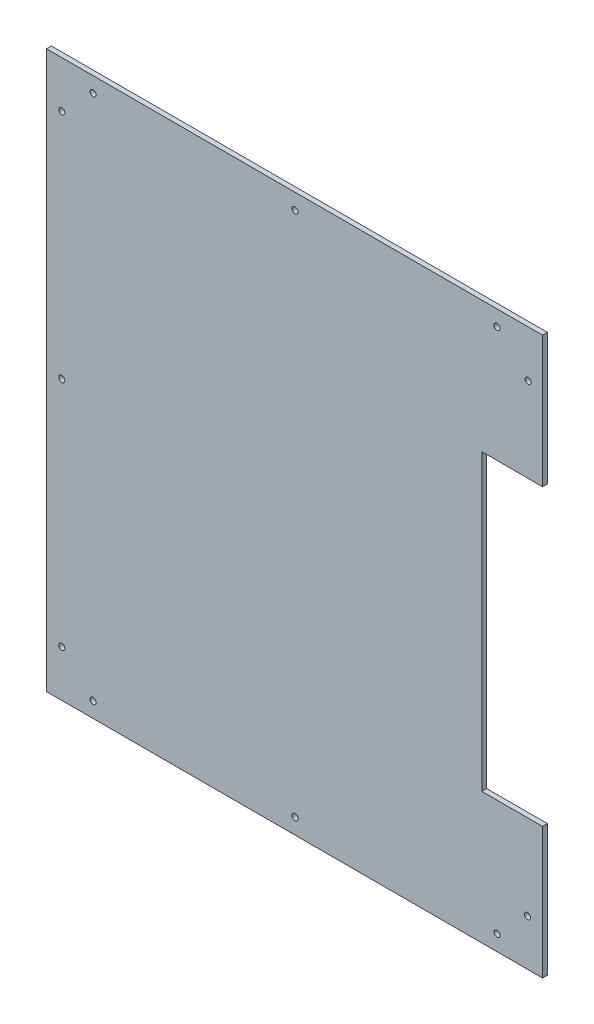
ISO-10303-21;
HEADER;
FILE_DESCRIPTION(('STEP AP214'),'2;1');
FILE_NAME('part.step','',(''),(''),'','','');
FILE_SCHEMA(('AUTOMOTIVE_DESIGN { 1 0 10303 214 1 1 1 1 }'));
ENDSEC;
DATA;
#1=APPLICATION_CONTEXT('core data for automotive mechanical design processes');
#2=APPLICATION_PROTOCOL_DEFINITION('international standard','automotive_design',2000,#1);
#3=PRODUCT_CONTEXT('',#1,'mechanical');
#4=PRODUCT('Part','Part','',(#3));
#5=PRODUCT_RELATED_PRODUCT_CATEGORY('part','',(#4));
#6=PRODUCT_DEFINITION_FORMATION('','',#4);
#7=PRODUCT_DEFINITION_CONTEXT('part definition',#1,'design');
#8=PRODUCT_DEFINITION('design','',#6,#7);
#9=PRODUCT_DEFINITION_SHAPE('','',#8);
#10=(LENGTH_UNIT() NAMED_UNIT(*) SI_UNIT(.MILLI.,.METRE.));
#11=(NAMED_UNIT(*) PLANE_ANGLE_UNIT() SI_UNIT($,.RADIAN.));
#12=(NAMED_UNIT(*) SI_UNIT($,.STERADIAN.) SOLID_ANGLE_UNIT());
#13=UNCERTAINTY_MEASURE_WITH_UNIT(LENGTH_MEASURE(1.E-05),#10,'distance_accuracy_value','');
#14=(GEOMETRIC_REPRESENTATION_CONTEXT(3) GLOBAL_UNCERTAINTY_ASSIGNED_CONTEXT((#13)) GLOBAL_UNIT_ASSIGNED_CONTEXT((#10,
#11,#12)) REPRESENTATION_CONTEXT('',''));
#15=CARTESIAN_POINT('',(0.,0.,0.));
#16=DIRECTION('',(0.,0.,1.));
#17=DIRECTION('',(1.,0.,0.));
#18=AXIS2_PLACEMENT_3D('',#15,#16,#17);
#19=CARTESIAN_POINT('',(0.,0.,4.));
#20=DIRECTION('',(0.,0.,-1.));
#21=DIRECTION('',(-1.,0.,0.));
#22=AXIS2_PLACEMENT_3D('',#19,#20,#21);
#23=PLANE('',#22);
#24=DIRECTION('',(0.,-1.,0.));
#25=VECTOR('',#24,1.);
#26=CARTESIAN_POINT('',(-226.678502872802,204.546030299711,4.));
#27=LINE('',#26,#25);
#28=CARTESIAN_POINT('',(-226.678502872802,204.546030299711,4.));
#29=VERTEX_POINT('',#28);
#30=CARTESIAN_POINT('',(-226.678502872802,-253.453969700293,4.));
#31=VERTEX_POINT('',#30);
#32=EDGE_CURVE('E146',#29,#31,#27,.T.);
#33=ORIENTED_EDGE('',*,*,#32,.T.);
#34=DIRECTION('',(1.,0.,0.));
#35=VECTOR('',#34,1.);
#36=CARTESIAN_POINT('',(181.321497127199,-253.453969700293,4.));
#37=LINE('',#36,#35);
#38=CARTESIAN_POINT('',(181.321497127199,-253.453969700293,4.));
#39=VERTEX_POINT('',#38);
#40=EDGE_CURVE('E94',#31,#39,#37,.T.);
#41=ORIENTED_EDGE('',*,*,#40,.T.);
#42=DIRECTION('',(0.,1.,0.));
#43=VECTOR('',#42,1.);
#44=CARTESIAN_POINT('',(181.321497127199,-145.45396970029,4.));
#45=LINE('',#44,#43);
#46=CARTESIAN_POINT('',(181.321497127199,-145.45396970029,4.));
#47=VERTEX_POINT('',#46);
#48=EDGE_CURVE('E161',#39,#47,#45,.T.);
#49=ORIENTED_EDGE('',*,*,#48,.T.);
#50=DIRECTION('',(-1.,0.,0.));
#51=VECTOR('',#50,1.);
#52=CARTESIAN_POINT('',(131.321497127199,-145.45396970029,4.));
#53=LINE('',#52,#51);
#54=CARTESIAN_POINT('',(131.321497127199,-145.45396970029,4.));
#55=VERTEX_POINT('',#54);
#56=EDGE_CURVE('E174',#47,#55,#53,.T.);
#57=ORIENTED_EDGE('',*,*,#56,.T.);
#58=DIRECTION('',(0.,1.,0.));
#59=VECTOR('',#58,1.);
#60=CARTESIAN_POINT('',(131.321497127199,-145.45396970029,4.));
#61=LINE('',#60,#59);
#62=CARTESIAN_POINT('',(131.321497127199,96.5460302997092,4.));
#63=VERTEX_POINT('',#62);
#64=EDGE_CURVE('E113',#55,#63,#61,.T.);
#65=ORIENTED_EDGE('',*,*,#64,.T.);
#66=DIRECTION('',(1.,0.,0.));
#67=VECTOR('',#66,1.);
#68=CARTESIAN_POINT('',(131.321497127199,96.5460302997092,4.));
#69=LINE('',#68,#67);
#70=CARTESIAN_POINT('',(181.321497127199,96.5460302997092,4.));
#71=VERTEX_POINT('',#70);
#72=EDGE_CURVE('E107',#63,#71,#69,.T.);
#73=ORIENTED_EDGE('',*,*,#72,.T.);
#74=DIRECTION('',(0.,1.,0.));
#75=VECTOR('',#74,1.);
#76=CARTESIAN_POINT('',(181.321497127199,204.546030299711,4.));
#77=LINE('',#76,#75);
#78=CARTESIAN_POINT('',(181.321497127199,204.546030299711,4.));
#79=VERTEX_POINT('',#78);
#80=EDGE_CURVE('E111',#71,#79,#77,.T.);
#81=ORIENTED_EDGE('',*,*,#80,.T.);
#82=DIRECTION('',(-1.,0.,0.));
#83=VECTOR('',#82,1.);
#84=CARTESIAN_POINT('',(181.321497127199,204.546030299711,4.));
#85=LINE('',#84,#83);
#86=EDGE_CURVE('E51',#79,#29,#85,.T.);
#87=ORIENTED_EDGE('',*,*,#86,.T.);
#88=EDGE_LOOP('',(#33,#41,#49,#57,#65,#73,#81,#87));
#89=FACE_BOUND('',#88,.T.);
#90=CARTESIAN_POINT('',(-214.178502872802,-215.2468629191,4.));
#91=DIRECTION('',(0.,0.,1.));
#92=DIRECTION('',(1.,0.,0.));
#93=AXIS2_PLACEMENT_3D('',#90,#91,#92);
#94=CIRCLE('',#93,2.5);
#95=CARTESIAN_POINT('',(-211.678502872802,-215.2468629191,4.));
#96=VERTEX_POINT('',#95);
#97=EDGE_CURVE('E135',#96,#96,#94,.T.);
#98=ORIENTED_EDGE('',*,*,#97,.F.);
#99=EDGE_LOOP('',(#98));
#100=FACE_BOUND('',#99,.T.);
#101=CARTESIAN_POINT('',(-188.471396091615,-240.907728533257,4.));
#102=DIRECTION('',(0.,0.,1.));
#103=DIRECTION('',(1.,0.,0.));
#104=AXIS2_PLACEMENT_3D('',#101,#102,#103);
#105=CIRCLE('',#104,2.49999999999997);
#106=CARTESIAN_POINT('',(-185.971396091615,-240.907728533257,4.));
#107=VERTEX_POINT('',#106);
#108=EDGE_CURVE('E183',#107,#107,#105,.T.);
#109=ORIENTED_EDGE('',*,*,#108,.F.);
#110=EDGE_LOOP('',(#109));
#111=FACE_BOUND('',#110,.T.);
#112=CARTESIAN_POINT('',(-22.324949482208,-240.600416309693,4.));
#113=DIRECTION('',(0.,0.,1.));
#114=DIRECTION('',(1.,0.,0.));
#115=AXIS2_PLACEMENT_3D('',#112,#113,#114);
#116=CIRCLE('',#115,2.5);
#117=CARTESIAN_POINT('',(-19.824949482208,-240.600416309693,4.));
#118=VERTEX_POINT('',#117);
#119=EDGE_CURVE('E189',#118,#118,#116,.T.);
#120=ORIENTED_EDGE('',*,*,#119,.F.);
#121=EDGE_LOOP('',(#120));
#122=FACE_BOUND('',#121,.T.);
#123=CARTESIAN_POINT('',(143.821776426278,-240.640809695857,4.));
#124=DIRECTION('',(0.,0.,1.));
#125=DIRECTION('',(1.,0.,0.));
#126=AXIS2_PLACEMENT_3D('',#123,#124,#125);
#127=CIRCLE('',#126,2.5);
#128=CARTESIAN_POINT('',(146.321776426278,-240.640809695857,4.));
#129=VERTEX_POINT('',#128);
#130=EDGE_CURVE('E195',#129,#129,#127,.T.);
#131=ORIENTED_EDGE('',*,*,#130,.F.);
#132=EDGE_LOOP('',(#131));
#133=FACE_BOUND('',#132,.T.);
#134=CARTESIAN_POINT('',(168.874598055023,-215.554555332963,4.));
#135=DIRECTION('',(0.,0.,1.));
#136=DIRECTION('',(1.,0.,0.));
#137=AXIS2_PLACEMENT_3D('',#134,#135,#136);
#138=CIRCLE('',#137,2.49999999999997);
#139=CARTESIAN_POINT('',(171.374598055023,-215.554555332963,4.));
#140=VERTEX_POINT('',#139);
#141=EDGE_CURVE('E201',#140,#140,#138,.T.);
#142=ORIENTED_EDGE('',*,*,#141,.F.);
#143=EDGE_LOOP('',(#142));
#144=FACE_BOUND('',#143,.T.);
#145=CARTESIAN_POINT('',(169.487625208089,166.030738682578,4.));
#146=DIRECTION('',(0.,0.,1.));
#147=DIRECTION('',(1.,0.,0.));
#148=AXIS2_PLACEMENT_3D('',#145,#146,#147);
#149=CIRCLE('',#148,2.49999999999997);
#150=CARTESIAN_POINT('',(171.987625208089,166.030738682578,4.));
#151=VERTEX_POINT('',#150);
#152=EDGE_CURVE('E207',#151,#151,#149,.T.);
#153=ORIENTED_EDGE('',*,*,#152,.F.);
#154=EDGE_LOOP('',(#153));
#155=FACE_BOUND('',#154,.T.);
#156=CARTESIAN_POINT('',(143.821776426278,191.732870295278,4.));
#157=DIRECTION('',(0.,0.,1.));
#158=DIRECTION('',(1.,0.,0.));
#159=AXIS2_PLACEMENT_3D('',#156,#157,#158);
#160=CIRCLE('',#159,2.50000000000002);
#161=CARTESIAN_POINT('',(146.321776426278,191.732870295278,4.));
#162=VERTEX_POINT('',#161);
#163=EDGE_CURVE('E213',#162,#162,#160,.T.);
#164=ORIENTED_EDGE('',*,*,#163,.F.);
#165=EDGE_LOOP('',(#164));
#166=FACE_BOUND('',#165,.T.);
#167=CARTESIAN_POINT('',(-22.324949482208,191.692476909114,4.));
#168=DIRECTION('',(0.,0.,1.));
#169=DIRECTION('',(1.,0.,0.));
#170=AXIS2_PLACEMENT_3D('',#167,#168,#169);
#171=CIRCLE('',#170,2.49999999999998);
#172=CARTESIAN_POINT('',(-19.824949482208,191.692476909114,4.));
#173=VERTEX_POINT('',#172);
#174=EDGE_CURVE('E219',#173,#173,#171,.T.);
#175=ORIENTED_EDGE('',*,*,#174,.F.);
#176=EDGE_LOOP('',(#175));
#177=FACE_BOUND('',#176,.T.);
#178=CARTESIAN_POINT('',(-188.471396091615,191.999789132678,4.));
#179=DIRECTION('',(0.,0.,1.));
#180=DIRECTION('',(1.,0.,0.));
#181=AXIS2_PLACEMENT_3D('',#178,#179,#180);
#182=CIRCLE('',#181,2.50000000000002);
#183=CARTESIAN_POINT('',(-185.971396091615,191.999789132678,4.));
#184=VERTEX_POINT('',#183);
#185=EDGE_CURVE('E225',#184,#184,#182,.T.);
#186=ORIENTED_EDGE('',*,*,#185,.F.);
#187=EDGE_LOOP('',(#186));
#188=FACE_BOUND('',#187,.T.);
#189=CARTESIAN_POINT('',(-214.178502872802,166.338923518521,4.));
#190=DIRECTION('',(0.,0.,1.));
#191=DIRECTION('',(1.,0.,0.));
#192=AXIS2_PLACEMENT_3D('',#189,#190,#191);
#193=CIRCLE('',#192,2.49999999999993);
#194=CARTESIAN_POINT('',(-211.678502872803,166.338923518521,4.));
#195=VERTEX_POINT('',#194);
#196=EDGE_CURVE('E231',#195,#195,#193,.T.);
#197=ORIENTED_EDGE('',*,*,#196,.F.);
#198=EDGE_LOOP('',(#197));
#199=FACE_BOUND('',#198,.T.);
#200=CARTESIAN_POINT('',(-214.178502872802,-24.453969700293,4.));
#201=DIRECTION('',(0.,0.,1.));
#202=DIRECTION('',(1.,0.,0.));
#203=AXIS2_PLACEMENT_3D('',#200,#201,#202);
#204=CIRCLE('',#203,2.5);
#205=CARTESIAN_POINT('',(-211.678502872802,-24.453969700293,4.));
#206=VERTEX_POINT('',#205);
#207=EDGE_CURVE('E237',#206,#206,#204,.T.);
#208=ORIENTED_EDGE('',*,*,#207,.F.);
#209=EDGE_LOOP('',(#208));
#210=FACE_BOUND('',#209,.T.);
#211=ADVANCED_FACE('F34',(#89,#100,#111,#122,#133,#144,#155,#166,#177,#188,#199,#210),#23,.F.);
#212=CARTESIAN_POINT('',(0.,0.,0.));
#213=DIRECTION('',(0.,0.,-1.));
#214=DIRECTION('',(-1.,0.,0.));
#215=AXIS2_PLACEMENT_3D('',#212,#213,#214);
#216=PLANE('',#215);
#217=CARTESIAN_POINT('',(-214.178502872802,166.338923518521,0.));
#218=DIRECTION('',(0.,0.,1.));
#219=DIRECTION('',(1.,0.,0.));
#220=AXIS2_PLACEMENT_3D('',#217,#218,#219);
#221=CIRCLE('',#220,2.49999999999993);
#222=CARTESIAN_POINT('',(-211.678502872803,166.338923518521,0.));
#223=VERTEX_POINT('',#222);
#224=EDGE_CURVE('E234',#223,#223,#221,.T.);
#225=ORIENTED_EDGE('',*,*,#224,.T.);
#226=EDGE_LOOP('',(#225));
#227=FACE_BOUND('',#226,.T.);
#228=CARTESIAN_POINT('',(-22.324949482208,191.692476909114,0.));
#229=DIRECTION('',(0.,0.,1.));
#230=DIRECTION('',(1.,0.,0.));
#231=AXIS2_PLACEMENT_3D('',#228,#229,#230);
#232=CIRCLE('',#231,2.49999999999998);
#233=CARTESIAN_POINT('',(-19.824949482208,191.692476909114,0.));
#234=VERTEX_POINT('',#233);
#235=EDGE_CURVE('E222',#234,#234,#232,.T.);
#236=ORIENTED_EDGE('',*,*,#235,.T.);
#237=EDGE_LOOP('',(#236));
#238=FACE_BOUND('',#237,.T.);
#239=CARTESIAN_POINT('',(169.487625208089,166.030738682578,0.));
#240=DIRECTION('',(0.,0.,1.));
#241=DIRECTION('',(1.,0.,0.));
#242=AXIS2_PLACEMENT_3D('',#239,#240,#241);
#243=CIRCLE('',#242,2.49999999999997);
#244=CARTESIAN_POINT('',(171.987625208089,166.030738682578,0.));
#245=VERTEX_POINT('',#244);
#246=EDGE_CURVE('E210',#245,#245,#243,.T.);
#247=ORIENTED_EDGE('',*,*,#246,.T.);
#248=EDGE_LOOP('',(#247));
#249=FACE_BOUND('',#248,.T.);
#250=CARTESIAN_POINT('',(143.821776426278,-240.640809695857,0.));
#251=DIRECTION('',(0.,0.,1.));
#252=DIRECTION('',(1.,0.,0.));
#253=AXIS2_PLACEMENT_3D('',#250,#251,#252);
#254=CIRCLE('',#253,2.5);
#255=CARTESIAN_POINT('',(146.321776426278,-240.640809695857,0.));
#256=VERTEX_POINT('',#255);
#257=EDGE_CURVE('E198',#256,#256,#254,.T.);
#258=ORIENTED_EDGE('',*,*,#257,.T.);
#259=EDGE_LOOP('',(#258));
#260=FACE_BOUND('',#259,.T.);
#261=CARTESIAN_POINT('',(-188.471396091615,-240.907728533257,0.));
#262=DIRECTION('',(0.,0.,1.));
#263=DIRECTION('',(1.,0.,0.));
#264=AXIS2_PLACEMENT_3D('',#261,#262,#263);
#265=CIRCLE('',#264,2.49999999999997);
#266=CARTESIAN_POINT('',(-185.971396091615,-240.907728533257,0.));
#267=VERTEX_POINT('',#266);
#268=EDGE_CURVE('E186',#267,#267,#265,.T.);
#269=ORIENTED_EDGE('',*,*,#268,.T.);
#270=EDGE_LOOP('',(#269));
#271=FACE_BOUND('',#270,.T.);
#272=DIRECTION('',(0.,-1.,0.));
#273=VECTOR('',#272,1.);
#274=CARTESIAN_POINT('',(-226.678502872802,204.546030299711,0.));
#275=LINE('',#274,#273);
#276=CARTESIAN_POINT('',(-226.678502872802,204.546030299711,0.));
#277=VERTEX_POINT('',#276);
#278=CARTESIAN_POINT('',(-226.678502872802,-253.453969700293,0.));
#279=VERTEX_POINT('',#278);
#280=EDGE_CURVE('E131',#277,#279,#275,.T.);
#281=ORIENTED_EDGE('',*,*,#280,.F.);
#282=DIRECTION('',(-1.,0.,0.));
#283=VECTOR('',#282,1.);
#284=CARTESIAN_POINT('',(181.321497127199,204.546030299711,0.));
#285=LINE('',#284,#283);
#286=CARTESIAN_POINT('',(181.321497127199,204.546030299711,0.));
#287=VERTEX_POINT('',#286);
#288=EDGE_CURVE('E86',#287,#277,#285,.T.);
#289=ORIENTED_EDGE('',*,*,#288,.F.);
#290=DIRECTION('',(0.,1.,0.));
#291=VECTOR('',#290,1.);
#292=CARTESIAN_POINT('',(181.321497127199,204.546030299711,0.));
#293=LINE('',#292,#291);
#294=CARTESIAN_POINT('',(181.321497127199,96.5460302997092,0.));
#295=VERTEX_POINT('',#294);
#296=EDGE_CURVE('E80',#295,#287,#293,.T.);
#297=ORIENTED_EDGE('',*,*,#296,.F.);
#298=DIRECTION('',(1.,0.,0.));
#299=VECTOR('',#298,1.);
#300=CARTESIAN_POINT('',(131.321497127199,96.5460302997092,0.));
#301=LINE('',#300,#299);
#302=CARTESIAN_POINT('',(131.321497127199,96.5460302997092,0.));
#303=VERTEX_POINT('',#302);
#304=EDGE_CURVE('E121',#303,#295,#301,.T.);
#305=ORIENTED_EDGE('',*,*,#304,.F.);
#306=DIRECTION('',(0.,1.,0.));
#307=VECTOR('',#306,1.);
#308=CARTESIAN_POINT('',(131.321497127199,-145.45396970029,0.));
#309=LINE('',#308,#307);
#310=CARTESIAN_POINT('',(131.321497127199,-145.45396970029,0.));
#311=VERTEX_POINT('',#310);
#312=EDGE_CURVE('E141',#311,#303,#309,.T.);
#313=ORIENTED_EDGE('',*,*,#312,.F.);
#314=DIRECTION('',(-1.,0.,0.));
#315=VECTOR('',#314,1.);
#316=CARTESIAN_POINT('',(131.321497127199,-145.45396970029,0.));
#317=LINE('',#316,#315);
#318=CARTESIAN_POINT('',(181.321497127199,-145.45396970029,0.));
#319=VERTEX_POINT('',#318);
#320=EDGE_CURVE('E139',#319,#311,#317,.T.);
#321=ORIENTED_EDGE('',*,*,#320,.F.);
#322=DIRECTION('',(0.,1.,0.));
#323=VECTOR('',#322,1.);
#324=CARTESIAN_POINT('',(181.321497127199,-145.45396970029,0.));
#325=LINE('',#324,#323);
#326=CARTESIAN_POINT('',(181.321497127199,-253.453969700293,0.));
#327=VERTEX_POINT('',#326);
#328=EDGE_CURVE('E137',#327,#319,#325,.T.);
#329=ORIENTED_EDGE('',*,*,#328,.F.);
#330=DIRECTION('',(1.,0.,0.));
#331=VECTOR('',#330,1.);
#332=CARTESIAN_POINT('',(181.321497127199,-253.453969700293,0.));
#333=LINE('',#332,#331);
#334=EDGE_CURVE('E134',#279,#327,#333,.T.);
#335=ORIENTED_EDGE('',*,*,#334,.F.);
#336=EDGE_LOOP('',(#281,#289,#297,#305,#313,#321,#329,#335));
#337=FACE_BOUND('',#336,.T.);
#338=CARTESIAN_POINT('',(-214.178502872802,-215.2468629191,0.));
#339=DIRECTION('',(0.,0.,1.));
#340=DIRECTION('',(1.,0.,0.));
#341=AXIS2_PLACEMENT_3D('',#338,#339,#340);
#342=CIRCLE('',#341,2.5);
#343=CARTESIAN_POINT('',(-211.678502872802,-215.2468629191,0.));
#344=VERTEX_POINT('',#343);
#345=EDGE_CURVE('E180',#344,#344,#342,.T.);
#346=ORIENTED_EDGE('',*,*,#345,.T.);
#347=EDGE_LOOP('',(#346));
#348=FACE_BOUND('',#347,.T.);
#349=CARTESIAN_POINT('',(-22.324949482208,-240.600416309693,0.));
#350=DIRECTION('',(0.,0.,1.));
#351=DIRECTION('',(1.,0.,0.));
#352=AXIS2_PLACEMENT_3D('',#349,#350,#351);
#353=CIRCLE('',#352,2.5);
#354=CARTESIAN_POINT('',(-19.824949482208,-240.600416309693,0.));
#355=VERTEX_POINT('',#354);
#356=EDGE_CURVE('E192',#355,#355,#353,.T.);
#357=ORIENTED_EDGE('',*,*,#356,.T.);
#358=EDGE_LOOP('',(#357));
#359=FACE_BOUND('',#358,.T.);
#360=CARTESIAN_POINT('',(168.874598055023,-215.554555332963,0.));
#361=DIRECTION('',(0.,0.,1.));
#362=DIRECTION('',(1.,0.,0.));
#363=AXIS2_PLACEMENT_3D('',#360,#361,#362);
#364=CIRCLE('',#363,2.49999999999997);
#365=CARTESIAN_POINT('',(171.374598055023,-215.554555332963,0.));
#366=VERTEX_POINT('',#365);
#367=EDGE_CURVE('E204',#366,#366,#364,.T.);
#368=ORIENTED_EDGE('',*,*,#367,.T.);
#369=EDGE_LOOP('',(#368));
#370=FACE_BOUND('',#369,.T.);
#371=CARTESIAN_POINT('',(143.821776426278,191.732870295278,0.));
#372=DIRECTION('',(0.,0.,1.));
#373=DIRECTION('',(1.,0.,0.));
#374=AXIS2_PLACEMENT_3D('',#371,#372,#373);
#375=CIRCLE('',#374,2.50000000000002);
#376=CARTESIAN_POINT('',(146.321776426278,191.732870295278,0.));
#377=VERTEX_POINT('',#376);
#378=EDGE_CURVE('E216',#377,#377,#375,.T.);
#379=ORIENTED_EDGE('',*,*,#378,.T.);
#380=EDGE_LOOP('',(#379));
#381=FACE_BOUND('',#380,.T.);
#382=CARTESIAN_POINT('',(-188.471396091615,191.999789132678,0.));
#383=DIRECTION('',(0.,0.,1.));
#384=DIRECTION('',(1.,0.,0.));
#385=AXIS2_PLACEMENT_3D('',#382,#383,#384);
#386=CIRCLE('',#385,2.50000000000002);
#387=CARTESIAN_POINT('',(-185.971396091615,191.999789132678,0.));
#388=VERTEX_POINT('',#387);
#389=EDGE_CURVE('E228',#388,#388,#386,.T.);
#390=ORIENTED_EDGE('',*,*,#389,.T.);
#391=EDGE_LOOP('',(#390));
#392=FACE_BOUND('',#391,.T.);
#393=CARTESIAN_POINT('',(-214.178502872802,-24.453969700293,0.));
#394=DIRECTION('',(0.,0.,1.));
#395=DIRECTION('',(1.,0.,0.));
#396=AXIS2_PLACEMENT_3D('',#393,#394,#395);
#397=CIRCLE('',#396,2.5);
#398=CARTESIAN_POINT('',(-211.678502872802,-24.453969700293,0.));
#399=VERTEX_POINT('',#398);
#400=EDGE_CURVE('E240',#399,#399,#397,.T.);
#401=ORIENTED_EDGE('',*,*,#400,.T.);
#402=EDGE_LOOP('',(#401));
#403=FACE_BOUND('',#402,.T.);
#404=ADVANCED_FACE('F165',(#227,#238,#249,#260,#271,#337,#348,#359,#370,#381,#392,#403),#216,.T.);
#405=CARTESIAN_POINT('',(-226.678502872802,204.546030299711,4.));
#406=DIRECTION('',(1.,0.,0.));
#407=DIRECTION('',(0.,0.,-1.));
#408=AXIS2_PLACEMENT_3D('',#405,#406,#407);
#409=PLANE('',#408);
#410=ORIENTED_EDGE('',*,*,#280,.T.);
#411=DIRECTION('',(0.,0.,-1.));
#412=VECTOR('',#411,1.);
#413=CARTESIAN_POINT('',(-226.678502872802,-253.453969700293,4.));
#414=LINE('',#413,#412);
#415=EDGE_CURVE('E11',#31,#279,#414,.T.);
#416=ORIENTED_EDGE('',*,*,#415,.F.);
#417=ORIENTED_EDGE('',*,*,#32,.F.);
#418=DIRECTION('',(0.,0.,-1.));
#419=VECTOR('',#418,1.);
#420=CARTESIAN_POINT('',(-226.678502872802,204.546030299711,4.));
#421=LINE('',#420,#419);
#422=EDGE_CURVE('E127',#29,#277,#421,.T.);
#423=ORIENTED_EDGE('',*,*,#422,.T.);
#424=EDGE_LOOP('',(#410,#416,#417,#423));
#425=FACE_BOUND('',#424,.T.);
#426=ADVANCED_FACE('F36',(#425),#409,.F.);
#427=CARTESIAN_POINT('',(181.321497127199,-253.453969700293,4.));
#428=DIRECTION('',(0.,1.,0.));
#429=DIRECTION('',(0.,0.,1.));
#430=AXIS2_PLACEMENT_3D('',#427,#428,#429);
#431=PLANE('',#430);
#432=ORIENTED_EDGE('',*,*,#334,.T.);
#433=DIRECTION('',(0.,0.,-1.));
#434=VECTOR('',#433,1.);
#435=CARTESIAN_POINT('',(181.321497127199,-253.453969700293,4.));
#436=LINE('',#435,#434);
#437=EDGE_CURVE('E43',#39,#327,#436,.T.);
#438=ORIENTED_EDGE('',*,*,#437,.F.);
#439=ORIENTED_EDGE('',*,*,#40,.F.);
#440=ORIENTED_EDGE('',*,*,#415,.T.);
#441=EDGE_LOOP('',(#432,#438,#439,#440));
#442=FACE_BOUND('',#441,.T.);
#443=ADVANCED_FACE('F272',(#442),#431,.F.);
#444=CARTESIAN_POINT('',(181.321497127199,-145.45396970029,4.));
#445=DIRECTION('',(-1.,0.,0.));
#446=DIRECTION('',(0.,0.,1.));
#447=AXIS2_PLACEMENT_3D('',#444,#445,#446);
#448=PLANE('',#447);
#449=ORIENTED_EDGE('',*,*,#328,.T.);
#450=DIRECTION('',(0.,0.,-1.));
#451=VECTOR('',#450,1.);
#452=CARTESIAN_POINT('',(181.321497127199,-145.45396970029,4.));
#453=LINE('',#452,#451);
#454=EDGE_CURVE('E153',#47,#319,#453,.T.);
#455=ORIENTED_EDGE('',*,*,#454,.F.);
#456=ORIENTED_EDGE('',*,*,#48,.F.);
#457=ORIENTED_EDGE('',*,*,#437,.T.);
#458=EDGE_LOOP('',(#449,#455,#456,#457));
#459=FACE_BOUND('',#458,.T.);
#460=ADVANCED_FACE('F159',(#459),#448,.F.);
#461=CARTESIAN_POINT('',(131.321497127199,-145.45396970029,4.));
#462=DIRECTION('',(0.,-1.,0.));
#463=DIRECTION('',(0.,0.,-1.));
#464=AXIS2_PLACEMENT_3D('',#461,#462,#463);
#465=PLANE('',#464);
#466=ORIENTED_EDGE('',*,*,#320,.T.);
#467=DIRECTION('',(0.,0.,-1.));
#468=VECTOR('',#467,1.);
#469=CARTESIAN_POINT('',(131.321497127199,-145.45396970029,4.));
#470=LINE('',#469,#468);
#471=EDGE_CURVE('E150',#55,#311,#470,.T.);
#472=ORIENTED_EDGE('',*,*,#471,.F.);
#473=ORIENTED_EDGE('',*,*,#56,.F.);
#474=ORIENTED_EDGE('',*,*,#454,.T.);
#475=EDGE_LOOP('',(#466,#472,#473,#474));
#476=FACE_BOUND('',#475,.T.);
#477=ADVANCED_FACE('F170',(#476),#465,.F.);
#478=CARTESIAN_POINT('',(131.321497127199,-145.45396970029,4.));
#479=DIRECTION('',(-1.,0.,0.));
#480=DIRECTION('',(0.,-1.,0.));
#481=AXIS2_PLACEMENT_3D('',#478,#479,#480);
#482=PLANE('',#481);
#483=ORIENTED_EDGE('',*,*,#312,.T.);
#484=DIRECTION('',(0.,0.,-1.));
#485=VECTOR('',#484,1.);
#486=CARTESIAN_POINT('',(131.321497127199,96.5460302997092,4.));
#487=LINE('',#486,#485);
#488=EDGE_CURVE('E122',#63,#303,#487,.T.);
#489=ORIENTED_EDGE('',*,*,#488,.F.);
#490=ORIENTED_EDGE('',*,*,#64,.F.);
#491=ORIENTED_EDGE('',*,*,#471,.T.);
#492=EDGE_LOOP('',(#483,#489,#490,#491));
#493=FACE_BOUND('',#492,.T.);
#494=ADVANCED_FACE('F173',(#493),#482,.F.);
#495=CARTESIAN_POINT('',(131.321497127199,96.5460302997092,4.));
#496=DIRECTION('',(0.,1.,0.));
#497=DIRECTION('',(0.,0.,1.));
#498=AXIS2_PLACEMENT_3D('',#495,#496,#497);
#499=PLANE('',#498);
#500=ORIENTED_EDGE('',*,*,#304,.T.);
#501=DIRECTION('',(0.,0.,-1.));
#502=VECTOR('',#501,1.);
#503=CARTESIAN_POINT('',(181.321497127199,96.5460302997092,4.));
#504=LINE('',#503,#502);
#505=EDGE_CURVE('E118',#71,#295,#504,.T.);
#506=ORIENTED_EDGE('',*,*,#505,.F.);
#507=ORIENTED_EDGE('',*,*,#72,.F.);
#508=ORIENTED_EDGE('',*,*,#488,.T.);
#509=EDGE_LOOP('',(#500,#506,#507,#508));
#510=FACE_BOUND('',#509,.T.);
#511=ADVANCED_FACE('F119',(#510),#499,.F.);
#512=CARTESIAN_POINT('',(181.321497127199,204.546030299711,4.));
#513=DIRECTION('',(-1.,0.,0.));
#514=DIRECTION('',(0.,0.,1.));
#515=AXIS2_PLACEMENT_3D('',#512,#513,#514);
#516=PLANE('',#515);
#517=ORIENTED_EDGE('',*,*,#296,.T.);
#518=DIRECTION('',(0.,0.,-1.));
#519=VECTOR('',#518,1.);
#520=CARTESIAN_POINT('',(181.321497127199,204.546030299711,4.));
#521=LINE('',#520,#519);
#522=EDGE_CURVE('E123',#79,#287,#521,.T.);
#523=ORIENTED_EDGE('',*,*,#522,.F.);
#524=ORIENTED_EDGE('',*,*,#80,.F.);
#525=ORIENTED_EDGE('',*,*,#505,.T.);
#526=EDGE_LOOP('',(#517,#523,#524,#525));
#527=FACE_BOUND('',#526,.T.);
#528=ADVANCED_FACE('F125',(#527),#516,.F.);
#529=CARTESIAN_POINT('',(181.321497127199,204.546030299711,4.));
#530=DIRECTION('',(0.,-1.,0.));
#531=DIRECTION('',(0.,0.,-1.));
#532=AXIS2_PLACEMENT_3D('',#529,#530,#531);
#533=PLANE('',#532);
#534=ORIENTED_EDGE('',*,*,#288,.T.);
#535=ORIENTED_EDGE('',*,*,#422,.F.);
#536=ORIENTED_EDGE('',*,*,#86,.F.);
#537=ORIENTED_EDGE('',*,*,#522,.T.);
#538=EDGE_LOOP('',(#534,#535,#536,#537));
#539=FACE_BOUND('',#538,.T.);
#540=ADVANCED_FACE('F260',(#539),#533,.F.);
#541=CARTESIAN_POINT('',(-214.178502872802,-215.2468629191,4.));
#542=DIRECTION('',(0.,0.,-1.));
#543=DIRECTION('',(-1.,0.,0.));
#544=AXIS2_PLACEMENT_3D('',#541,#542,#543);
#545=CYLINDRICAL_SURFACE('',#544,2.5);
#546=ORIENTED_EDGE('',*,*,#97,.T.);
#547=EDGE_LOOP('',(#546));
#548=FACE_BOUND('',#547,.T.);
#549=ORIENTED_EDGE('',*,*,#345,.F.);
#550=EDGE_LOOP('',(#549));
#551=FACE_BOUND('',#550,.T.);
#552=ADVANCED_FACE('F257',(#548,#551),#545,.F.);
#553=CARTESIAN_POINT('',(-188.471396091615,-240.907728533257,4.));
#554=DIRECTION('',(0.,0.,-1.));
#555=DIRECTION('',(-1.,0.,0.));
#556=AXIS2_PLACEMENT_3D('',#553,#554,#555);
#557=CYLINDRICAL_SURFACE('',#556,2.49999999999997);
#558=ORIENTED_EDGE('',*,*,#108,.T.);
#559=EDGE_LOOP('',(#558));
#560=FACE_BOUND('',#559,.T.);
#561=ORIENTED_EDGE('',*,*,#268,.F.);
#562=EDGE_LOOP('',(#561));
#563=FACE_BOUND('',#562,.T.);
#564=ADVANCED_FACE('F338',(#560,#563),#557,.F.);
#565=CARTESIAN_POINT('',(-22.324949482208,-240.600416309693,4.));
#566=DIRECTION('',(0.,0.,-1.));
#567=DIRECTION('',(-1.,0.,0.));
#568=AXIS2_PLACEMENT_3D('',#565,#566,#567);
#569=CYLINDRICAL_SURFACE('',#568,2.5);
#570=ORIENTED_EDGE('',*,*,#119,.T.);
#571=EDGE_LOOP('',(#570));
#572=FACE_BOUND('',#571,.T.);
#573=ORIENTED_EDGE('',*,*,#356,.F.);
#574=EDGE_LOOP('',(#573));
#575=FACE_BOUND('',#574,.T.);
#576=ADVANCED_FACE('F346',(#572,#575),#569,.F.);
#577=CARTESIAN_POINT('',(143.821776426278,-240.640809695857,4.));
#578=DIRECTION('',(0.,0.,-1.));
#579=DIRECTION('',(-1.,0.,0.));
#580=AXIS2_PLACEMENT_3D('',#577,#578,#579);
#581=CYLINDRICAL_SURFACE('',#580,2.5);
#582=ORIENTED_EDGE('',*,*,#130,.T.);
#583=EDGE_LOOP('',(#582));
#584=FACE_BOUND('',#583,.T.);
#585=ORIENTED_EDGE('',*,*,#257,.F.);
#586=EDGE_LOOP('',(#585));
#587=FACE_BOUND('',#586,.T.);
#588=ADVANCED_FACE('F354',(#584,#587),#581,.F.);
#589=CARTESIAN_POINT('',(168.874598055023,-215.554555332963,4.));
#590=DIRECTION('',(0.,0.,-1.));
#591=DIRECTION('',(-1.,0.,0.));
#592=AXIS2_PLACEMENT_3D('',#589,#590,#591);
#593=CYLINDRICAL_SURFACE('',#592,2.49999999999997);
#594=ORIENTED_EDGE('',*,*,#141,.T.);
#595=EDGE_LOOP('',(#594));
#596=FACE_BOUND('',#595,.T.);
#597=ORIENTED_EDGE('',*,*,#367,.F.);
#598=EDGE_LOOP('',(#597));
#599=FACE_BOUND('',#598,.T.);
#600=ADVANCED_FACE('F363',(#596,#599),#593,.F.);
#601=CARTESIAN_POINT('',(169.487625208089,166.030738682578,4.));
#602=DIRECTION('',(0.,0.,-1.));
#603=DIRECTION('',(-1.,0.,0.));
#604=AXIS2_PLACEMENT_3D('',#601,#602,#603);
#605=CYLINDRICAL_SURFACE('',#604,2.49999999999997);
#606=ORIENTED_EDGE('',*,*,#152,.T.);
#607=EDGE_LOOP('',(#606));
#608=FACE_BOUND('',#607,.T.);
#609=ORIENTED_EDGE('',*,*,#246,.F.);
#610=EDGE_LOOP('',(#609));
#611=FACE_BOUND('',#610,.T.);
#612=ADVANCED_FACE('F372',(#608,#611),#605,.F.);
#613=CARTESIAN_POINT('',(143.821776426278,191.732870295278,4.));
#614=DIRECTION('',(0.,0.,-1.));
#615=DIRECTION('',(-1.,0.,0.));
#616=AXIS2_PLACEMENT_3D('',#613,#614,#615);
#617=CYLINDRICAL_SURFACE('',#616,2.50000000000002);
#618=ORIENTED_EDGE('',*,*,#163,.T.);
#619=EDGE_LOOP('',(#618));
#620=FACE_BOUND('',#619,.T.);
#621=ORIENTED_EDGE('',*,*,#378,.F.);
#622=EDGE_LOOP('',(#621));
#623=FACE_BOUND('',#622,.T.);
#624=ADVANCED_FACE('F381',(#620,#623),#617,.F.);
#625=CARTESIAN_POINT('',(-22.324949482208,191.692476909114,4.));
#626=DIRECTION('',(0.,0.,-1.));
#627=DIRECTION('',(-1.,0.,0.));
#628=AXIS2_PLACEMENT_3D('',#625,#626,#627);
#629=CYLINDRICAL_SURFACE('',#628,2.49999999999998);
#630=ORIENTED_EDGE('',*,*,#174,.T.);
#631=EDGE_LOOP('',(#630));
#632=FACE_BOUND('',#631,.T.);
#633=ORIENTED_EDGE('',*,*,#235,.F.);
#634=EDGE_LOOP('',(#633));
#635=FACE_BOUND('',#634,.T.);
#636=ADVANCED_FACE('F390',(#632,#635),#629,.F.);
#637=CARTESIAN_POINT('',(-188.471396091615,191.999789132678,4.));
#638=DIRECTION('',(0.,0.,-1.));
#639=DIRECTION('',(-1.,0.,0.));
#640=AXIS2_PLACEMENT_3D('',#637,#638,#639);
#641=CYLINDRICAL_SURFACE('',#640,2.50000000000002);
#642=ORIENTED_EDGE('',*,*,#185,.T.);
#643=EDGE_LOOP('',(#642));
#644=FACE_BOUND('',#643,.T.);
#645=ORIENTED_EDGE('',*,*,#389,.F.);
#646=EDGE_LOOP('',(#645));
#647=FACE_BOUND('',#646,.T.);
#648=ADVANCED_FACE('F399',(#644,#647),#641,.F.);
#649=CARTESIAN_POINT('',(-214.178502872802,166.338923518521,4.));
#650=DIRECTION('',(0.,0.,-1.));
#651=DIRECTION('',(-1.,0.,0.));
#652=AXIS2_PLACEMENT_3D('',#649,#650,#651);
#653=CYLINDRICAL_SURFACE('',#652,2.49999999999993);
#654=ORIENTED_EDGE('',*,*,#196,.T.);
#655=EDGE_LOOP('',(#654));
#656=FACE_BOUND('',#655,.T.);
#657=ORIENTED_EDGE('',*,*,#224,.F.);
#658=EDGE_LOOP('',(#657));
#659=FACE_BOUND('',#658,.T.);
#660=ADVANCED_FACE('F408',(#656,#659),#653,.F.);
#661=CARTESIAN_POINT('',(-214.178502872802,-24.453969700293,4.));
#662=DIRECTION('',(0.,0.,-1.));
#663=DIRECTION('',(-1.,0.,0.));
#664=AXIS2_PLACEMENT_3D('',#661,#662,#663);
#665=CYLINDRICAL_SURFACE('',#664,2.5);
#666=ORIENTED_EDGE('',*,*,#207,.T.);
#667=EDGE_LOOP('',(#666));
#668=FACE_BOUND('',#667,.T.);
#669=ORIENTED_EDGE('',*,*,#400,.F.);
#670=EDGE_LOOP('',(#669));
#671=FACE_BOUND('',#670,.T.);
#672=ADVANCED_FACE('F246',(#668,#671),#665,.F.);
#673=CLOSED_SHELL('',(#211,#404,#426,#443,#460,#477,#494,#511,#528,#540,#552,#564,#576,#588,
#600,#612,#624,#636,#648,#660,#672));
#674=MANIFOLD_SOLID_BREP('B2',#673);
#675=ADVANCED_BREP_SHAPE_REPRESENTATION('',(#18,#674),#14);
#676=SHAPE_DEFINITION_REPRESENTATION(#9,#675);
ENDSEC;
END-ISO-10303-21;
